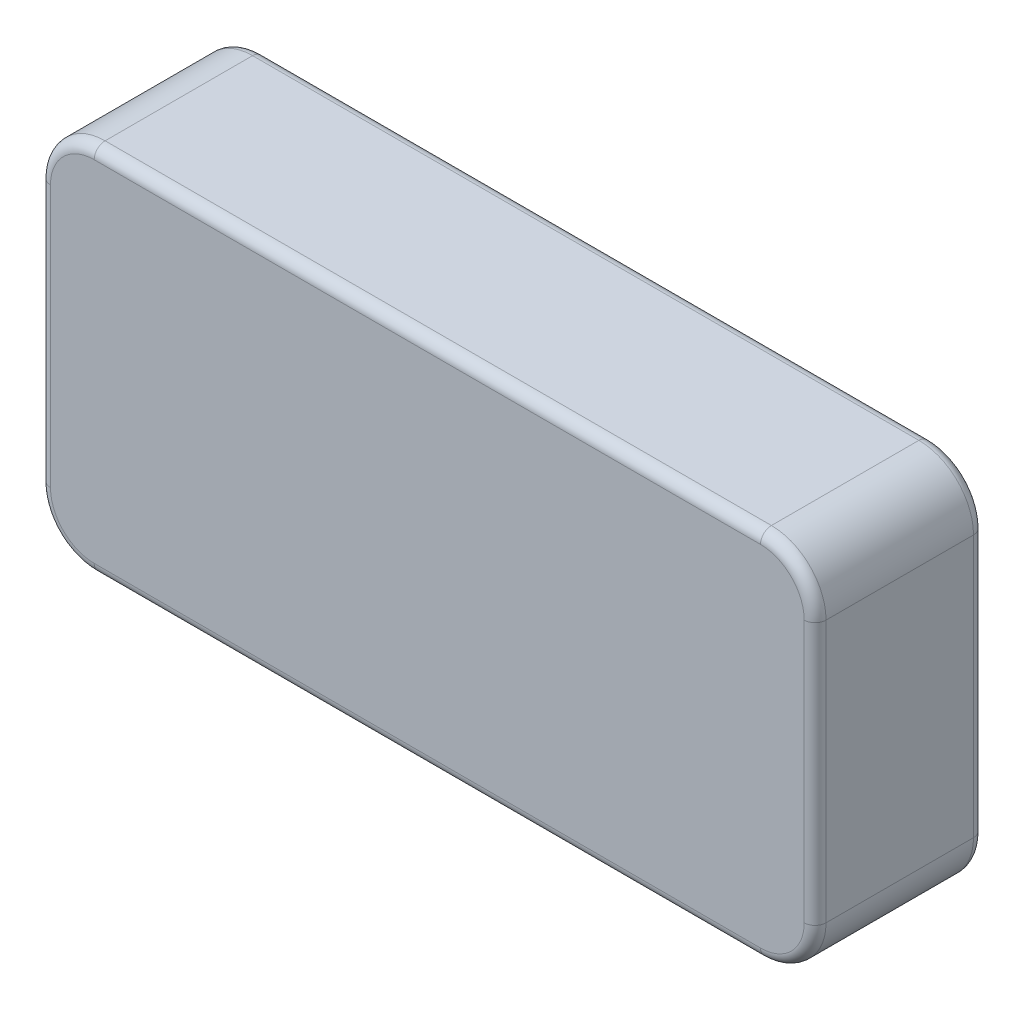
ISO-10303-21;
HEADER;
FILE_DESCRIPTION(('STEP AP214'),'2;1');
FILE_NAME('part.step','',(''),(''),'','','');
FILE_SCHEMA(('AUTOMOTIVE_DESIGN { 1 0 10303 214 1 1 1 1 }'));
ENDSEC;
DATA;
#1=APPLICATION_CONTEXT('core data for automotive mechanical design processes');
#2=APPLICATION_PROTOCOL_DEFINITION('international standard','automotive_design',2000,#1);
#3=PRODUCT_CONTEXT('',#1,'mechanical');
#4=PRODUCT('Part','Part','',(#3));
#5=PRODUCT_RELATED_PRODUCT_CATEGORY('part','',(#4));
#6=PRODUCT_DEFINITION_FORMATION('','',#4);
#7=PRODUCT_DEFINITION_CONTEXT('part definition',#1,'design');
#8=PRODUCT_DEFINITION('design','',#6,#7);
#9=PRODUCT_DEFINITION_SHAPE('','',#8);
#10=(LENGTH_UNIT() NAMED_UNIT(*) SI_UNIT(.MILLI.,.METRE.));
#11=(NAMED_UNIT(*) PLANE_ANGLE_UNIT() SI_UNIT($,.RADIAN.));
#12=(NAMED_UNIT(*) SI_UNIT($,.STERADIAN.) SOLID_ANGLE_UNIT());
#13=UNCERTAINTY_MEASURE_WITH_UNIT(LENGTH_MEASURE(1.E-05),#10,'distance_accuracy_value','');
#14=(GEOMETRIC_REPRESENTATION_CONTEXT(3) GLOBAL_UNCERTAINTY_ASSIGNED_CONTEXT((#13)) GLOBAL_UNIT_ASSIGNED_CONTEXT((#10,
#11,#12)) REPRESENTATION_CONTEXT('',''));
#15=CARTESIAN_POINT('',(0.,0.,0.));
#16=DIRECTION('',(0.,0.,1.));
#17=DIRECTION('',(1.,0.,0.));
#18=AXIS2_PLACEMENT_3D('',#15,#16,#17);
#19=CARTESIAN_POINT('',(-35.5,-17.,15.5));
#20=DIRECTION('',(1.,0.,0.));
#21=DIRECTION('',(0.,0.,-1.));
#22=AXIS2_PLACEMENT_3D('',#19,#20,#21);
#23=PLANE('',#22);
#24=DIRECTION('',(0.,0.,-1.));
#25=VECTOR('',#24,1.);
#26=CARTESIAN_POINT('',(-35.5,-12.,15.5));
#27=LINE('',#26,#25);
#28=CARTESIAN_POINT('',(-35.5,-12.,1.));
#29=VERTEX_POINT('',#28);
#30=CARTESIAN_POINT('',(-35.5,-12.,14.5));
#31=VERTEX_POINT('',#30);
#32=EDGE_CURVE('E172',#29,#31,#27,.F.);
#33=ORIENTED_EDGE('',*,*,#32,.T.);
#34=DIRECTION('',(0.,-1.,0.));
#35=VECTOR('',#34,1.);
#36=CARTESIAN_POINT('',(-35.5,12.,14.5));
#37=LINE('',#36,#35);
#38=CARTESIAN_POINT('',(-35.5,12.,14.5));
#39=VERTEX_POINT('',#38);
#40=EDGE_CURVE('E196',#31,#39,#37,.F.);
#41=ORIENTED_EDGE('',*,*,#40,.T.);
#42=DIRECTION('',(0.,0.,-1.));
#43=VECTOR('',#42,1.);
#44=CARTESIAN_POINT('',(-35.5,12.,15.5));
#45=LINE('',#44,#43);
#46=CARTESIAN_POINT('',(-35.5,12.,1.));
#47=VERTEX_POINT('',#46);
#48=EDGE_CURVE('E300',#39,#47,#45,.T.);
#49=ORIENTED_EDGE('',*,*,#48,.T.);
#50=DIRECTION('',(0.,-1.,0.));
#51=VECTOR('',#50,1.);
#52=CARTESIAN_POINT('',(-35.5,-17.,1.));
#53=LINE('',#52,#51);
#54=EDGE_CURVE('E194',#47,#29,#53,.T.);
#55=ORIENTED_EDGE('',*,*,#54,.T.);
#56=EDGE_LOOP('',(#33,#41,#49,#55));
#57=FACE_BOUND('',#56,.T.);
#58=ADVANCED_FACE('F39',(#57),#23,.F.);
#59=CARTESIAN_POINT('',(35.5,-17.,15.5));
#60=DIRECTION('',(0.,1.,0.));
#61=DIRECTION('',(-1.,0.,0.));
#62=AXIS2_PLACEMENT_3D('',#59,#60,#61);
#63=PLANE('',#62);
#64=DIRECTION('',(0.,0.,-1.));
#65=VECTOR('',#64,1.);
#66=CARTESIAN_POINT('',(30.5,-17.,15.5));
#67=LINE('',#66,#65);
#68=CARTESIAN_POINT('',(30.5,-17.,1.));
#69=VERTEX_POINT('',#68);
#70=CARTESIAN_POINT('',(30.5,-17.,14.5));
#71=VERTEX_POINT('',#70);
#72=EDGE_CURVE('E283',#69,#71,#67,.F.);
#73=ORIENTED_EDGE('',*,*,#72,.T.);
#74=DIRECTION('',(1.,0.,0.));
#75=VECTOR('',#74,1.);
#76=CARTESIAN_POINT('',(-30.5,-17.,14.5));
#77=LINE('',#76,#75);
#78=CARTESIAN_POINT('',(-30.5,-17.,14.5));
#79=VERTEX_POINT('',#78);
#80=EDGE_CURVE('E188',#71,#79,#77,.F.);
#81=ORIENTED_EDGE('',*,*,#80,.T.);
#82=DIRECTION('',(0.,0.,-1.));
#83=VECTOR('',#82,1.);
#84=CARTESIAN_POINT('',(-30.5,-17.,15.5));
#85=LINE('',#84,#83);
#86=CARTESIAN_POINT('',(-30.5,-17.,1.));
#87=VERTEX_POINT('',#86);
#88=EDGE_CURVE('E297',#79,#87,#85,.T.);
#89=ORIENTED_EDGE('',*,*,#88,.T.);
#90=DIRECTION('',(1.,0.,0.));
#91=VECTOR('',#90,1.);
#92=CARTESIAN_POINT('',(35.5,-17.,1.));
#93=LINE('',#92,#91);
#94=EDGE_CURVE('E186',#87,#69,#93,.T.);
#95=ORIENTED_EDGE('',*,*,#94,.T.);
#96=EDGE_LOOP('',(#73,#81,#89,#95));
#97=FACE_BOUND('',#96,.T.);
#98=ADVANCED_FACE('F323',(#97),#63,.F.);
#99=CARTESIAN_POINT('',(35.5,-17.,15.5));
#100=DIRECTION('',(-1.,0.,0.));
#101=DIRECTION('',(0.,0.,1.));
#102=AXIS2_PLACEMENT_3D('',#99,#100,#101);
#103=PLANE('',#102);
#104=DIRECTION('',(0.,0.,-1.));
#105=VECTOR('',#104,1.);
#106=CARTESIAN_POINT('',(35.5,12.,15.5));
#107=LINE('',#106,#105);
#108=CARTESIAN_POINT('',(35.5,12.,1.));
#109=VERTEX_POINT('',#108);
#110=CARTESIAN_POINT('',(35.5,12.,14.5));
#111=VERTEX_POINT('',#110);
#112=EDGE_CURVE('E288',#109,#111,#107,.F.);
#113=ORIENTED_EDGE('',*,*,#112,.T.);
#114=DIRECTION('',(0.,1.,0.));
#115=VECTOR('',#114,1.);
#116=CARTESIAN_POINT('',(35.5,-12.,14.5));
#117=LINE('',#116,#115);
#118=CARTESIAN_POINT('',(35.5,-12.,14.5));
#119=VERTEX_POINT('',#118);
#120=EDGE_CURVE('E213',#111,#119,#117,.F.);
#121=ORIENTED_EDGE('',*,*,#120,.T.);
#122=DIRECTION('',(0.,0.,-1.));
#123=VECTOR('',#122,1.);
#124=CARTESIAN_POINT('',(35.5,-12.,15.5));
#125=LINE('',#124,#123);
#126=CARTESIAN_POINT('',(35.5,-12.,1.));
#127=VERTEX_POINT('',#126);
#128=EDGE_CURVE('E281',#119,#127,#125,.T.);
#129=ORIENTED_EDGE('',*,*,#128,.T.);
#130=DIRECTION('',(0.,1.,0.));
#131=VECTOR('',#130,1.);
#132=CARTESIAN_POINT('',(35.5,-17.,1.));
#133=LINE('',#132,#131);
#134=EDGE_CURVE('E211',#127,#109,#133,.T.);
#135=ORIENTED_EDGE('',*,*,#134,.T.);
#136=EDGE_LOOP('',(#113,#121,#129,#135));
#137=FACE_BOUND('',#136,.T.);
#138=ADVANCED_FACE('F286',(#137),#103,.F.);
#139=CARTESIAN_POINT('',(35.5,17.,15.5));
#140=DIRECTION('',(0.,-1.,0.));
#141=DIRECTION('',(1.,0.,0.));
#142=AXIS2_PLACEMENT_3D('',#139,#140,#141);
#143=PLANE('',#142);
#144=DIRECTION('',(0.,0.,-1.));
#145=VECTOR('',#144,1.);
#146=CARTESIAN_POINT('',(-30.5,17.,15.5));
#147=LINE('',#146,#145);
#148=CARTESIAN_POINT('',(-30.5,17.,1.));
#149=VERTEX_POINT('',#148);
#150=CARTESIAN_POINT('',(-30.5,17.,14.5));
#151=VERTEX_POINT('',#150);
#152=EDGE_CURVE('E244',#149,#151,#147,.F.);
#153=ORIENTED_EDGE('',*,*,#152,.T.);
#154=DIRECTION('',(-1.,0.,0.));
#155=VECTOR('',#154,1.);
#156=CARTESIAN_POINT('',(30.5,17.,14.5));
#157=LINE('',#156,#155);
#158=CARTESIAN_POINT('',(30.5,17.,14.5));
#159=VERTEX_POINT('',#158);
#160=EDGE_CURVE('E205',#151,#159,#157,.F.);
#161=ORIENTED_EDGE('',*,*,#160,.T.);
#162=DIRECTION('',(0.,0.,-1.));
#163=VECTOR('',#162,1.);
#164=CARTESIAN_POINT('',(30.5,17.,15.5));
#165=LINE('',#164,#163);
#166=CARTESIAN_POINT('',(30.5,17.,1.));
#167=VERTEX_POINT('',#166);
#168=EDGE_CURVE('E289',#159,#167,#165,.T.);
#169=ORIENTED_EDGE('',*,*,#168,.T.);
#170=DIRECTION('',(-1.,0.,0.));
#171=VECTOR('',#170,1.);
#172=CARTESIAN_POINT('',(35.5,17.,1.));
#173=LINE('',#172,#171);
#174=EDGE_CURVE('E203',#167,#149,#173,.T.);
#175=ORIENTED_EDGE('',*,*,#174,.T.);
#176=EDGE_LOOP('',(#153,#161,#169,#175));
#177=FACE_BOUND('',#176,.T.);
#178=ADVANCED_FACE('F352',(#177),#143,.F.);
#179=CARTESIAN_POINT('',(0.,0.,15.5));
#180=DIRECTION('',(0.,0.,1.));
#181=DIRECTION('',(1.,0.,0.));
#182=AXIS2_PLACEMENT_3D('',#179,#180,#181);
#183=PLANE('',#182);
#184=DIRECTION('',(1.,0.,0.));
#185=VECTOR('',#184,1.);
#186=CARTESIAN_POINT('',(30.5,-16.,15.5));
#187=LINE('',#186,#185);
#188=CARTESIAN_POINT('',(-30.5,-16.,15.5));
#189=VERTEX_POINT('',#188);
#190=CARTESIAN_POINT('',(30.5,-16.,15.5));
#191=VERTEX_POINT('',#190);
#192=EDGE_CURVE('E176',#189,#191,#187,.T.);
#193=ORIENTED_EDGE('',*,*,#192,.T.);
#194=CARTESIAN_POINT('',(30.5,-12.,15.5));
#195=DIRECTION('',(0.,0.,1.));
#196=DIRECTION('',(1.,0.,0.));
#197=AXIS2_PLACEMENT_3D('',#194,#195,#196);
#198=CIRCLE('',#197,4.);
#199=CARTESIAN_POINT('',(34.5,-12.,15.5));
#200=VERTEX_POINT('',#199);
#201=EDGE_CURVE('E157',#191,#200,#198,.T.);
#202=ORIENTED_EDGE('',*,*,#201,.T.);
#203=DIRECTION('',(0.,1.,0.));
#204=VECTOR('',#203,1.);
#205=CARTESIAN_POINT('',(34.5,12.,15.5));
#206=LINE('',#205,#204);
#207=CARTESIAN_POINT('',(34.5,12.,15.5));
#208=VERTEX_POINT('',#207);
#209=EDGE_CURVE('E165',#200,#208,#206,.T.);
#210=ORIENTED_EDGE('',*,*,#209,.T.);
#211=CARTESIAN_POINT('',(30.5,12.,15.5));
#212=DIRECTION('',(0.,0.,1.));
#213=DIRECTION('',(1.,0.,0.));
#214=AXIS2_PLACEMENT_3D('',#211,#212,#213);
#215=CIRCLE('',#214,4.);
#216=CARTESIAN_POINT('',(30.5,16.,15.5));
#217=VERTEX_POINT('',#216);
#218=EDGE_CURVE('E171',#208,#217,#215,.T.);
#219=ORIENTED_EDGE('',*,*,#218,.T.);
#220=DIRECTION('',(-1.,0.,0.));
#221=VECTOR('',#220,1.);
#222=CARTESIAN_POINT('',(-30.5,16.,15.5));
#223=LINE('',#222,#221);
#224=CARTESIAN_POINT('',(-30.5,16.,15.5));
#225=VERTEX_POINT('',#224);
#226=EDGE_CURVE('E306',#217,#225,#223,.T.);
#227=ORIENTED_EDGE('',*,*,#226,.T.);
#228=CARTESIAN_POINT('',(-30.5,12.,15.5));
#229=DIRECTION('',(0.,0.,1.));
#230=DIRECTION('',(1.,0.,0.));
#231=AXIS2_PLACEMENT_3D('',#228,#229,#230);
#232=CIRCLE('',#231,4.);
#233=CARTESIAN_POINT('',(-34.5,12.,15.5));
#234=VERTEX_POINT('',#233);
#235=EDGE_CURVE('E308',#225,#234,#232,.T.);
#236=ORIENTED_EDGE('',*,*,#235,.T.);
#237=DIRECTION('',(0.,-1.,0.));
#238=VECTOR('',#237,1.);
#239=CARTESIAN_POINT('',(-34.5,-12.,15.5));
#240=LINE('',#239,#238);
#241=CARTESIAN_POINT('',(-34.5,-12.,15.5));
#242=VERTEX_POINT('',#241);
#243=EDGE_CURVE('E310',#234,#242,#240,.T.);
#244=ORIENTED_EDGE('',*,*,#243,.T.);
#245=CARTESIAN_POINT('',(-30.5,-12.,15.5));
#246=DIRECTION('',(0.,0.,1.));
#247=DIRECTION('',(1.,0.,0.));
#248=AXIS2_PLACEMENT_3D('',#245,#246,#247);
#249=CIRCLE('',#248,4.);
#250=EDGE_CURVE('E181',#242,#189,#249,.T.);
#251=ORIENTED_EDGE('',*,*,#250,.T.);
#252=EDGE_LOOP('',(#193,#202,#210,#219,#227,#236,#244,#251));
#253=FACE_BOUND('',#252,.T.);
#254=ADVANCED_FACE('F174',(#253),#183,.T.);
#255=CARTESIAN_POINT('',(0.,0.,0.));
#256=DIRECTION('',(0.,0.,1.));
#257=DIRECTION('',(1.,0.,0.));
#258=AXIS2_PLACEMENT_3D('',#255,#256,#257);
#259=PLANE('',#258);
#260=DIRECTION('',(0.,-1.,0.));
#261=VECTOR('',#260,1.);
#262=CARTESIAN_POINT('',(-34.5,0.,0.));
#263=LINE('',#262,#261);
#264=CARTESIAN_POINT('',(-34.5,-12.,0.));
#265=VERTEX_POINT('',#264);
#266=CARTESIAN_POINT('',(-34.5,12.,0.));
#267=VERTEX_POINT('',#266);
#268=EDGE_CURVE('E48',#265,#267,#263,.F.);
#269=ORIENTED_EDGE('',*,*,#268,.T.);
#270=CARTESIAN_POINT('',(-30.5,12.,0.));
#271=DIRECTION('',(0.,0.,1.));
#272=DIRECTION('',(1.,0.,0.));
#273=AXIS2_PLACEMENT_3D('',#270,#271,#272);
#274=CIRCLE('',#273,4.);
#275=CARTESIAN_POINT('',(-30.5,16.,0.));
#276=VERTEX_POINT('',#275);
#277=EDGE_CURVE('E11',#267,#276,#274,.F.);
#278=ORIENTED_EDGE('',*,*,#277,.T.);
#279=DIRECTION('',(-1.,0.,0.));
#280=VECTOR('',#279,1.);
#281=CARTESIAN_POINT('',(0.,16.,0.));
#282=LINE('',#281,#280);
#283=CARTESIAN_POINT('',(30.5,16.,0.));
#284=VERTEX_POINT('',#283);
#285=EDGE_CURVE('E215',#276,#284,#282,.F.);
#286=ORIENTED_EDGE('',*,*,#285,.T.);
#287=CARTESIAN_POINT('',(30.5,12.,0.));
#288=DIRECTION('',(0.,0.,1.));
#289=DIRECTION('',(1.,0.,0.));
#290=AXIS2_PLACEMENT_3D('',#287,#288,#289);
#291=CIRCLE('',#290,4.);
#292=CARTESIAN_POINT('',(34.5,12.,0.));
#293=VERTEX_POINT('',#292);
#294=EDGE_CURVE('E217',#284,#293,#291,.F.);
#295=ORIENTED_EDGE('',*,*,#294,.T.);
#296=DIRECTION('',(0.,1.,0.));
#297=VECTOR('',#296,1.);
#298=CARTESIAN_POINT('',(34.5,0.,0.));
#299=LINE('',#298,#297);
#300=CARTESIAN_POINT('',(34.5,-12.,0.));
#301=VERTEX_POINT('',#300);
#302=EDGE_CURVE('E219',#293,#301,#299,.F.);
#303=ORIENTED_EDGE('',*,*,#302,.T.);
#304=CARTESIAN_POINT('',(30.5,-12.,0.));
#305=DIRECTION('',(0.,0.,1.));
#306=DIRECTION('',(1.,0.,0.));
#307=AXIS2_PLACEMENT_3D('',#304,#305,#306);
#308=CIRCLE('',#307,4.);
#309=CARTESIAN_POINT('',(30.5,-16.,0.));
#310=VERTEX_POINT('',#309);
#311=EDGE_CURVE('E221',#301,#310,#308,.F.);
#312=ORIENTED_EDGE('',*,*,#311,.T.);
#313=DIRECTION('',(1.,0.,0.));
#314=VECTOR('',#313,1.);
#315=CARTESIAN_POINT('',(0.,-16.,0.));
#316=LINE('',#315,#314);
#317=CARTESIAN_POINT('',(-30.5,-16.,0.));
#318=VERTEX_POINT('',#317);
#319=EDGE_CURVE('E223',#310,#318,#316,.F.);
#320=ORIENTED_EDGE('',*,*,#319,.T.);
#321=CARTESIAN_POINT('',(-30.5,-12.,0.));
#322=DIRECTION('',(0.,0.,1.));
#323=DIRECTION('',(1.,0.,0.));
#324=AXIS2_PLACEMENT_3D('',#321,#322,#323);
#325=CIRCLE('',#324,4.);
#326=EDGE_CURVE('E59',#318,#265,#325,.F.);
#327=ORIENTED_EDGE('',*,*,#326,.T.);
#328=EDGE_LOOP('',(#269,#278,#286,#295,#303,#312,#320,#327));
#329=FACE_BOUND('',#328,.T.);
#330=ADVANCED_FACE('F339',(#329),#259,.F.);
#331=CARTESIAN_POINT('',(30.5,12.,15.5));
#332=DIRECTION('',(0.,0.,-1.));
#333=DIRECTION('',(-1.,0.,0.));
#334=AXIS2_PLACEMENT_3D('',#331,#332,#333);
#335=CYLINDRICAL_SURFACE('',#334,5.);
#336=ORIENTED_EDGE('',*,*,#168,.F.);
#337=CARTESIAN_POINT('',(30.5,12.,14.5));
#338=DIRECTION('',(0.,0.,1.));
#339=DIRECTION('',(1.,0.,0.));
#340=AXIS2_PLACEMENT_3D('',#337,#338,#339);
#341=CIRCLE('',#340,5.);
#342=EDGE_CURVE('E209',#159,#111,#341,.F.);
#343=ORIENTED_EDGE('',*,*,#342,.T.);
#344=ORIENTED_EDGE('',*,*,#112,.F.);
#345=CARTESIAN_POINT('',(30.5,12.,1.));
#346=DIRECTION('',(0.,0.,1.));
#347=DIRECTION('',(1.,0.,0.));
#348=AXIS2_PLACEMENT_3D('',#345,#346,#347);
#349=CIRCLE('',#348,5.);
#350=EDGE_CURVE('E207',#109,#167,#349,.T.);
#351=ORIENTED_EDGE('',*,*,#350,.T.);
#352=EDGE_LOOP('',(#336,#343,#344,#351));
#353=FACE_BOUND('',#352,.T.);
#354=ADVANCED_FACE('F376',(#353),#335,.T.);
#355=CARTESIAN_POINT('',(-30.5,-12.,15.5));
#356=DIRECTION('',(0.,0.,-1.));
#357=DIRECTION('',(-1.,0.,0.));
#358=AXIS2_PLACEMENT_3D('',#355,#356,#357);
#359=CYLINDRICAL_SURFACE('',#358,5.);
#360=ORIENTED_EDGE('',*,*,#88,.F.);
#361=CARTESIAN_POINT('',(-30.5,-12.,14.5));
#362=DIRECTION('',(0.,0.,1.));
#363=DIRECTION('',(1.,0.,0.));
#364=AXIS2_PLACEMENT_3D('',#361,#362,#363);
#365=CIRCLE('',#364,5.);
#366=EDGE_CURVE('E192',#79,#31,#365,.F.);
#367=ORIENTED_EDGE('',*,*,#366,.T.);
#368=ORIENTED_EDGE('',*,*,#32,.F.);
#369=CARTESIAN_POINT('',(-30.5,-12.,1.));
#370=DIRECTION('',(0.,0.,1.));
#371=DIRECTION('',(1.,0.,0.));
#372=AXIS2_PLACEMENT_3D('',#369,#370,#371);
#373=CIRCLE('',#372,5.);
#374=EDGE_CURVE('E190',#29,#87,#373,.T.);
#375=ORIENTED_EDGE('',*,*,#374,.T.);
#376=EDGE_LOOP('',(#360,#367,#368,#375));
#377=FACE_BOUND('',#376,.T.);
#378=ADVANCED_FACE('F325',(#377),#359,.T.);
#379=CARTESIAN_POINT('',(-30.5,12.,15.5));
#380=DIRECTION('',(0.,0.,-1.));
#381=DIRECTION('',(-1.,0.,0.));
#382=AXIS2_PLACEMENT_3D('',#379,#380,#381);
#383=CYLINDRICAL_SURFACE('',#382,5.);
#384=ORIENTED_EDGE('',*,*,#48,.F.);
#385=CARTESIAN_POINT('',(-30.5,12.,14.5));
#386=DIRECTION('',(0.,0.,1.));
#387=DIRECTION('',(1.,0.,0.));
#388=AXIS2_PLACEMENT_3D('',#385,#386,#387);
#389=CIRCLE('',#388,5.);
#390=EDGE_CURVE('E201',#39,#151,#389,.F.);
#391=ORIENTED_EDGE('',*,*,#390,.T.);
#392=ORIENTED_EDGE('',*,*,#152,.F.);
#393=CARTESIAN_POINT('',(-30.5,12.,1.));
#394=DIRECTION('',(0.,0.,1.));
#395=DIRECTION('',(1.,0.,0.));
#396=AXIS2_PLACEMENT_3D('',#393,#394,#395);
#397=CIRCLE('',#396,5.);
#398=EDGE_CURVE('E198',#149,#47,#397,.T.);
#399=ORIENTED_EDGE('',*,*,#398,.T.);
#400=EDGE_LOOP('',(#384,#391,#392,#399));
#401=FACE_BOUND('',#400,.T.);
#402=ADVANCED_FACE('F357',(#401),#383,.T.);
#403=CARTESIAN_POINT('',(30.5,-12.,15.5));
#404=DIRECTION('',(0.,0.,-1.));
#405=DIRECTION('',(-1.,0.,0.));
#406=AXIS2_PLACEMENT_3D('',#403,#404,#405);
#407=CYLINDRICAL_SURFACE('',#406,5.);
#408=ORIENTED_EDGE('',*,*,#128,.F.);
#409=CARTESIAN_POINT('',(30.5,-12.,14.5));
#410=DIRECTION('',(0.,0.,1.));
#411=DIRECTION('',(1.,0.,0.));
#412=AXIS2_PLACEMENT_3D('',#409,#410,#411);
#413=CIRCLE('',#412,5.);
#414=EDGE_CURVE('E159',#119,#71,#413,.F.);
#415=ORIENTED_EDGE('',*,*,#414,.T.);
#416=ORIENTED_EDGE('',*,*,#72,.F.);
#417=CARTESIAN_POINT('',(30.5,-12.,1.));
#418=DIRECTION('',(0.,0.,1.));
#419=DIRECTION('',(1.,0.,0.));
#420=AXIS2_PLACEMENT_3D('',#417,#418,#419);
#421=CIRCLE('',#420,5.);
#422=EDGE_CURVE('E178',#69,#127,#421,.T.);
#423=ORIENTED_EDGE('',*,*,#422,.T.);
#424=EDGE_LOOP('',(#408,#415,#416,#423));
#425=FACE_BOUND('',#424,.T.);
#426=ADVANCED_FACE('F280',(#425),#407,.T.);
#427=CARTESIAN_POINT('',(-30.5,12.,14.5));
#428=DIRECTION('',(0.,0.,1.));
#429=DIRECTION('',(1.,0.,0.));
#430=AXIS2_PLACEMENT_3D('',#427,#428,#429);
#431=TOROIDAL_SURFACE('',#430,4.,1.);
#432=CARTESIAN_POINT('',(-30.5,16.,14.5));
#433=DIRECTION('',(1.,0.,0.));
#434=DIRECTION('',(0.,0.,-1.));
#435=AXIS2_PLACEMENT_3D('',#432,#433,#434);
#436=CIRCLE('',#435,1.);
#437=EDGE_CURVE('E238',#151,#225,#436,.T.);
#438=ORIENTED_EDGE('',*,*,#437,.F.);
#439=ORIENTED_EDGE('',*,*,#390,.F.);
#440=CARTESIAN_POINT('',(-34.5,12.,14.5));
#441=DIRECTION('',(0.,-1.,0.));
#442=DIRECTION('',(0.,0.,-1.));
#443=AXIS2_PLACEMENT_3D('',#440,#441,#442);
#444=CIRCLE('',#443,1.);
#445=EDGE_CURVE('E241',#234,#39,#444,.T.);
#446=ORIENTED_EDGE('',*,*,#445,.F.);
#447=ORIENTED_EDGE('',*,*,#235,.F.);
#448=EDGE_LOOP('',(#438,#439,#446,#447));
#449=FACE_BOUND('',#448,.T.);
#450=ADVANCED_FACE('F361',(#449),#431,.T.);
#451=CARTESIAN_POINT('',(-34.5,0.,14.5));
#452=DIRECTION('',(0.,1.,0.));
#453=DIRECTION('',(0.,0.,1.));
#454=AXIS2_PLACEMENT_3D('',#451,#452,#453);
#455=CYLINDRICAL_SURFACE('',#454,1.);
#456=ORIENTED_EDGE('',*,*,#445,.T.);
#457=ORIENTED_EDGE('',*,*,#40,.F.);
#458=CARTESIAN_POINT('',(-34.5,-12.,14.5));
#459=DIRECTION('',(0.,-1.,0.));
#460=DIRECTION('',(0.,0.,-1.));
#461=AXIS2_PLACEMENT_3D('',#458,#459,#460);
#462=CIRCLE('',#461,1.);
#463=EDGE_CURVE('E235',#242,#31,#462,.T.);
#464=ORIENTED_EDGE('',*,*,#463,.F.);
#465=ORIENTED_EDGE('',*,*,#243,.F.);
#466=EDGE_LOOP('',(#456,#457,#464,#465));
#467=FACE_BOUND('',#466,.T.);
#468=ADVANCED_FACE('F366',(#467),#455,.T.);
#469=CARTESIAN_POINT('',(0.,16.,14.5));
#470=DIRECTION('',(1.,0.,0.));
#471=DIRECTION('',(0.,1.,0.));
#472=AXIS2_PLACEMENT_3D('',#469,#470,#471);
#473=CYLINDRICAL_SURFACE('',#472,1.);
#474=ORIENTED_EDGE('',*,*,#437,.T.);
#475=ORIENTED_EDGE('',*,*,#226,.F.);
#476=CARTESIAN_POINT('',(30.5,16.,14.5));
#477=DIRECTION('',(1.,0.,0.));
#478=DIRECTION('',(0.,0.,-1.));
#479=AXIS2_PLACEMENT_3D('',#476,#477,#478);
#480=CIRCLE('',#479,1.);
#481=EDGE_CURVE('E232',#159,#217,#480,.T.);
#482=ORIENTED_EDGE('',*,*,#481,.F.);
#483=ORIENTED_EDGE('',*,*,#160,.F.);
#484=EDGE_LOOP('',(#474,#475,#482,#483));
#485=FACE_BOUND('',#484,.T.);
#486=ADVANCED_FACE('F398',(#485),#473,.T.);
#487=CARTESIAN_POINT('',(-30.5,-12.,14.5));
#488=DIRECTION('',(0.,0.,1.));
#489=DIRECTION('',(1.,0.,0.));
#490=AXIS2_PLACEMENT_3D('',#487,#488,#489);
#491=TOROIDAL_SURFACE('',#490,4.,1.);
#492=ORIENTED_EDGE('',*,*,#463,.T.);
#493=ORIENTED_EDGE('',*,*,#366,.F.);
#494=CARTESIAN_POINT('',(-30.5,-16.,14.5));
#495=DIRECTION('',(1.,0.,0.));
#496=DIRECTION('',(0.,0.,-1.));
#497=AXIS2_PLACEMENT_3D('',#494,#495,#496);
#498=CIRCLE('',#497,1.);
#499=EDGE_CURVE('E229',#189,#79,#498,.T.);
#500=ORIENTED_EDGE('',*,*,#499,.F.);
#501=ORIENTED_EDGE('',*,*,#250,.F.);
#502=EDGE_LOOP('',(#492,#493,#500,#501));
#503=FACE_BOUND('',#502,.T.);
#504=ADVANCED_FACE('F317',(#503),#491,.T.);
#505=CARTESIAN_POINT('',(30.5,12.,14.5));
#506=DIRECTION('',(0.,0.,1.));
#507=DIRECTION('',(1.,0.,0.));
#508=AXIS2_PLACEMENT_3D('',#505,#506,#507);
#509=TOROIDAL_SURFACE('',#508,4.,1.);
#510=ORIENTED_EDGE('',*,*,#481,.T.);
#511=ORIENTED_EDGE('',*,*,#218,.F.);
#512=CARTESIAN_POINT('',(34.5,12.,14.5));
#513=DIRECTION('',(0.,-1.,0.));
#514=DIRECTION('',(0.,0.,-1.));
#515=AXIS2_PLACEMENT_3D('',#512,#513,#514);
#516=CIRCLE('',#515,1.);
#517=EDGE_CURVE('E168',#111,#208,#516,.T.);
#518=ORIENTED_EDGE('',*,*,#517,.F.);
#519=ORIENTED_EDGE('',*,*,#342,.F.);
#520=EDGE_LOOP('',(#510,#511,#518,#519));
#521=FACE_BOUND('',#520,.T.);
#522=ADVANCED_FACE('F392',(#521),#509,.T.);
#523=CARTESIAN_POINT('',(0.,-16.,14.5));
#524=DIRECTION('',(-1.,0.,0.));
#525=DIRECTION('',(0.,-1.,0.));
#526=AXIS2_PLACEMENT_3D('',#523,#524,#525);
#527=CYLINDRICAL_SURFACE('',#526,1.);
#528=ORIENTED_EDGE('',*,*,#499,.T.);
#529=ORIENTED_EDGE('',*,*,#80,.F.);
#530=CARTESIAN_POINT('',(30.5,-16.,14.5));
#531=DIRECTION('',(1.,0.,0.));
#532=DIRECTION('',(0.,0.,-1.));
#533=AXIS2_PLACEMENT_3D('',#530,#531,#532);
#534=CIRCLE('',#533,1.);
#535=EDGE_CURVE('E162',#191,#71,#534,.T.);
#536=ORIENTED_EDGE('',*,*,#535,.F.);
#537=ORIENTED_EDGE('',*,*,#192,.F.);
#538=EDGE_LOOP('',(#528,#529,#536,#537));
#539=FACE_BOUND('',#538,.T.);
#540=ADVANCED_FACE('F320',(#539),#527,.T.);
#541=CARTESIAN_POINT('',(34.5,0.,14.5));
#542=DIRECTION('',(0.,-1.,0.));
#543=DIRECTION('',(0.,0.,-1.));
#544=AXIS2_PLACEMENT_3D('',#541,#542,#543);
#545=CYLINDRICAL_SURFACE('',#544,1.);
#546=ORIENTED_EDGE('',*,*,#517,.T.);
#547=ORIENTED_EDGE('',*,*,#209,.F.);
#548=CARTESIAN_POINT('',(34.5,-12.,14.5));
#549=DIRECTION('',(0.,-1.,0.));
#550=DIRECTION('',(0.,0.,-1.));
#551=AXIS2_PLACEMENT_3D('',#548,#549,#550);
#552=CIRCLE('',#551,1.);
#553=EDGE_CURVE('E153',#119,#200,#552,.T.);
#554=ORIENTED_EDGE('',*,*,#553,.F.);
#555=ORIENTED_EDGE('',*,*,#120,.F.);
#556=EDGE_LOOP('',(#546,#547,#554,#555));
#557=FACE_BOUND('',#556,.T.);
#558=ADVANCED_FACE('F166',(#557),#545,.T.);
#559=CARTESIAN_POINT('',(30.5,-12.,14.5));
#560=DIRECTION('',(0.,0.,1.));
#561=DIRECTION('',(1.,0.,0.));
#562=AXIS2_PLACEMENT_3D('',#559,#560,#561);
#563=TOROIDAL_SURFACE('',#562,4.,1.);
#564=ORIENTED_EDGE('',*,*,#535,.T.);
#565=ORIENTED_EDGE('',*,*,#414,.F.);
#566=ORIENTED_EDGE('',*,*,#553,.T.);
#567=ORIENTED_EDGE('',*,*,#201,.F.);
#568=EDGE_LOOP('',(#564,#565,#566,#567));
#569=FACE_BOUND('',#568,.T.);
#570=ADVANCED_FACE('F155',(#569),#563,.T.);
#571=CARTESIAN_POINT('',(30.5,-12.,1.));
#572=DIRECTION('',(0.,0.,1.));
#573=DIRECTION('',(1.,0.,0.));
#574=AXIS2_PLACEMENT_3D('',#571,#572,#573);
#575=TOROIDAL_SURFACE('',#574,4.,1.);
#576=CARTESIAN_POINT('',(34.5,-12.,1.));
#577=DIRECTION('',(0.,1.,0.));
#578=DIRECTION('',(0.,0.,1.));
#579=AXIS2_PLACEMENT_3D('',#576,#577,#578);
#580=CIRCLE('',#579,1.);
#581=EDGE_CURVE('E260',#127,#301,#580,.T.);
#582=ORIENTED_EDGE('',*,*,#581,.F.);
#583=ORIENTED_EDGE('',*,*,#422,.F.);
#584=CARTESIAN_POINT('',(30.5,-16.,1.));
#585=DIRECTION('',(-1.,0.,0.));
#586=DIRECTION('',(0.,0.,1.));
#587=AXIS2_PLACEMENT_3D('',#584,#585,#586);
#588=CIRCLE('',#587,1.);
#589=EDGE_CURVE('E43',#310,#69,#588,.T.);
#590=ORIENTED_EDGE('',*,*,#589,.F.);
#591=ORIENTED_EDGE('',*,*,#311,.F.);
#592=EDGE_LOOP('',(#582,#583,#590,#591));
#593=FACE_BOUND('',#592,.T.);
#594=ADVANCED_FACE('F41',(#593),#575,.T.);
#595=CARTESIAN_POINT('',(35.5,-16.,1.));
#596=DIRECTION('',(1.,0.,0.));
#597=DIRECTION('',(0.,1.,0.));
#598=AXIS2_PLACEMENT_3D('',#595,#596,#597);
#599=CYLINDRICAL_SURFACE('',#598,1.);
#600=ORIENTED_EDGE('',*,*,#589,.T.);
#601=ORIENTED_EDGE('',*,*,#94,.F.);
#602=CARTESIAN_POINT('',(-30.5,-16.,1.));
#603=DIRECTION('',(-1.,0.,0.));
#604=DIRECTION('',(0.,0.,1.));
#605=AXIS2_PLACEMENT_3D('',#602,#603,#604);
#606=CIRCLE('',#605,1.);
#607=EDGE_CURVE('E258',#318,#87,#606,.T.);
#608=ORIENTED_EDGE('',*,*,#607,.F.);
#609=ORIENTED_EDGE('',*,*,#319,.F.);
#610=EDGE_LOOP('',(#600,#601,#608,#609));
#611=FACE_BOUND('',#610,.T.);
#612=ADVANCED_FACE('F271',(#611),#599,.T.);
#613=CARTESIAN_POINT('',(34.5,-17.,1.));
#614=DIRECTION('',(0.,1.,0.));
#615=DIRECTION('',(0.,0.,1.));
#616=AXIS2_PLACEMENT_3D('',#613,#614,#615);
#617=CYLINDRICAL_SURFACE('',#616,1.);
#618=ORIENTED_EDGE('',*,*,#581,.T.);
#619=ORIENTED_EDGE('',*,*,#302,.F.);
#620=CARTESIAN_POINT('',(34.5,12.,1.));
#621=DIRECTION('',(0.,1.,0.));
#622=DIRECTION('',(0.,0.,1.));
#623=AXIS2_PLACEMENT_3D('',#620,#621,#622);
#624=CIRCLE('',#623,1.);
#625=EDGE_CURVE('E255',#109,#293,#624,.T.);
#626=ORIENTED_EDGE('',*,*,#625,.F.);
#627=ORIENTED_EDGE('',*,*,#134,.F.);
#628=EDGE_LOOP('',(#618,#619,#626,#627));
#629=FACE_BOUND('',#628,.T.);
#630=ADVANCED_FACE('F416',(#629),#617,.T.);
#631=CARTESIAN_POINT('',(-30.5,-12.,1.));
#632=DIRECTION('',(0.,0.,1.));
#633=DIRECTION('',(1.,0.,0.));
#634=AXIS2_PLACEMENT_3D('',#631,#632,#633);
#635=TOROIDAL_SURFACE('',#634,4.,1.);
#636=ORIENTED_EDGE('',*,*,#607,.T.);
#637=ORIENTED_EDGE('',*,*,#374,.F.);
#638=CARTESIAN_POINT('',(-34.5,-12.,1.));
#639=DIRECTION('',(0.,1.,0.));
#640=DIRECTION('',(0.,0.,1.));
#641=AXIS2_PLACEMENT_3D('',#638,#639,#640);
#642=CIRCLE('',#641,1.);
#643=EDGE_CURVE('E252',#265,#29,#642,.T.);
#644=ORIENTED_EDGE('',*,*,#643,.F.);
#645=ORIENTED_EDGE('',*,*,#326,.F.);
#646=EDGE_LOOP('',(#636,#637,#644,#645));
#647=FACE_BOUND('',#646,.T.);
#648=ADVANCED_FACE('F329',(#647),#635,.T.);
#649=CARTESIAN_POINT('',(30.5,12.,1.));
#650=DIRECTION('',(0.,0.,1.));
#651=DIRECTION('',(1.,0.,0.));
#652=AXIS2_PLACEMENT_3D('',#649,#650,#651);
#653=TOROIDAL_SURFACE('',#652,4.,1.);
#654=ORIENTED_EDGE('',*,*,#625,.T.);
#655=ORIENTED_EDGE('',*,*,#294,.F.);
#656=CARTESIAN_POINT('',(30.5,16.,1.));
#657=DIRECTION('',(-1.,0.,0.));
#658=DIRECTION('',(0.,0.,1.));
#659=AXIS2_PLACEMENT_3D('',#656,#657,#658);
#660=CIRCLE('',#659,1.);
#661=EDGE_CURVE('E249',#167,#284,#660,.T.);
#662=ORIENTED_EDGE('',*,*,#661,.F.);
#663=ORIENTED_EDGE('',*,*,#350,.F.);
#664=EDGE_LOOP('',(#654,#655,#662,#663));
#665=FACE_BOUND('',#664,.T.);
#666=ADVANCED_FACE('F344',(#665),#653,.T.);
#667=CARTESIAN_POINT('',(-34.5,-17.,1.));
#668=DIRECTION('',(0.,-1.,0.));
#669=DIRECTION('',(0.,0.,-1.));
#670=AXIS2_PLACEMENT_3D('',#667,#668,#669);
#671=CYLINDRICAL_SURFACE('',#670,1.);
#672=ORIENTED_EDGE('',*,*,#643,.T.);
#673=ORIENTED_EDGE('',*,*,#54,.F.);
#674=CARTESIAN_POINT('',(-34.5,12.,1.));
#675=DIRECTION('',(0.,1.,0.));
#676=DIRECTION('',(0.,0.,1.));
#677=AXIS2_PLACEMENT_3D('',#674,#675,#676);
#678=CIRCLE('',#677,1.);
#679=EDGE_CURVE('E247',#267,#47,#678,.T.);
#680=ORIENTED_EDGE('',*,*,#679,.F.);
#681=ORIENTED_EDGE('',*,*,#268,.F.);
#682=EDGE_LOOP('',(#672,#673,#680,#681));
#683=FACE_BOUND('',#682,.T.);
#684=ADVANCED_FACE('F332',(#683),#671,.T.);
#685=CARTESIAN_POINT('',(35.5,16.,1.));
#686=DIRECTION('',(-1.,0.,0.));
#687=DIRECTION('',(0.,-1.,0.));
#688=AXIS2_PLACEMENT_3D('',#685,#686,#687);
#689=CYLINDRICAL_SURFACE('',#688,1.);
#690=ORIENTED_EDGE('',*,*,#661,.T.);
#691=ORIENTED_EDGE('',*,*,#285,.F.);
#692=CARTESIAN_POINT('',(-30.5,16.,1.));
#693=DIRECTION('',(-1.,0.,0.));
#694=DIRECTION('',(0.,0.,1.));
#695=AXIS2_PLACEMENT_3D('',#692,#693,#694);
#696=CIRCLE('',#695,1.);
#697=EDGE_CURVE('E245',#149,#276,#696,.T.);
#698=ORIENTED_EDGE('',*,*,#697,.F.);
#699=ORIENTED_EDGE('',*,*,#174,.F.);
#700=EDGE_LOOP('',(#690,#691,#698,#699));
#701=FACE_BOUND('',#700,.T.);
#702=ADVANCED_FACE('F348',(#701),#689,.T.);
#703=CARTESIAN_POINT('',(-30.5,12.,1.));
#704=DIRECTION('',(0.,0.,1.));
#705=DIRECTION('',(1.,0.,0.));
#706=AXIS2_PLACEMENT_3D('',#703,#704,#705);
#707=TOROIDAL_SURFACE('',#706,4.,1.);
#708=ORIENTED_EDGE('',*,*,#679,.T.);
#709=ORIENTED_EDGE('',*,*,#398,.F.);
#710=ORIENTED_EDGE('',*,*,#697,.T.);
#711=ORIENTED_EDGE('',*,*,#277,.F.);
#712=EDGE_LOOP('',(#708,#709,#710,#711));
#713=FACE_BOUND('',#712,.T.);
#714=ADVANCED_FACE('F336',(#713),#707,.T.);
#715=CLOSED_SHELL('',(#58,#98,#138,#178,#254,#330,#354,#378,#402,#426,#450,#468,#486,#504,#522,
#540,#558,#570,#594,#612,#630,#648,#666,#684,#702,#714));
#716=MANIFOLD_SOLID_BREP('B2',#715);
#717=ADVANCED_BREP_SHAPE_REPRESENTATION('',(#18,#716),#14);
#718=SHAPE_DEFINITION_REPRESENTATION(#9,#717);
ENDSEC;
END-ISO-10303-21;
